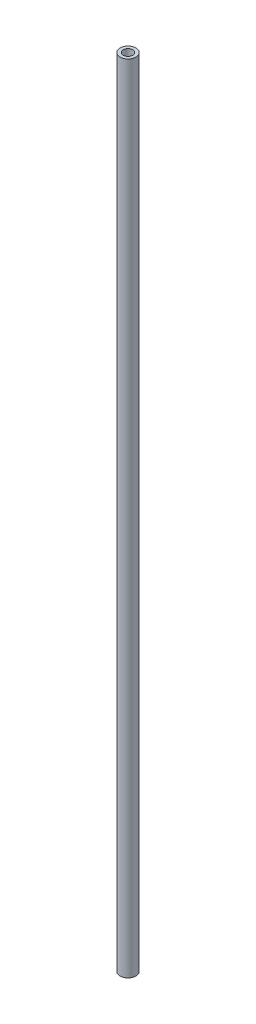
ISO-10303-21;
HEADER;
FILE_DESCRIPTION(('STEP AP214'),'2;1');
FILE_NAME('part.step','',(''),(''),'','','');
FILE_SCHEMA(('AUTOMOTIVE_DESIGN { 1 0 10303 214 1 1 1 1 }'));
ENDSEC;
DATA;
#1=APPLICATION_CONTEXT('core data for automotive mechanical design processes');
#2=APPLICATION_PROTOCOL_DEFINITION('international standard','automotive_design',2000,#1);
#3=PRODUCT_CONTEXT('',#1,'mechanical');
#4=PRODUCT('Part','Part','',(#3));
#5=PRODUCT_RELATED_PRODUCT_CATEGORY('part','',(#4));
#6=PRODUCT_DEFINITION_FORMATION('','',#4);
#7=PRODUCT_DEFINITION_CONTEXT('part definition',#1,'design');
#8=PRODUCT_DEFINITION('design','',#6,#7);
#9=PRODUCT_DEFINITION_SHAPE('','',#8);
#10=(LENGTH_UNIT() NAMED_UNIT(*) SI_UNIT(.MILLI.,.METRE.));
#11=(NAMED_UNIT(*) PLANE_ANGLE_UNIT() SI_UNIT($,.RADIAN.));
#12=(NAMED_UNIT(*) SI_UNIT($,.STERADIAN.) SOLID_ANGLE_UNIT());
#13=UNCERTAINTY_MEASURE_WITH_UNIT(LENGTH_MEASURE(1.E-05),#10,'distance_accuracy_value','');
#14=(GEOMETRIC_REPRESENTATION_CONTEXT(3) GLOBAL_UNCERTAINTY_ASSIGNED_CONTEXT((#13)) GLOBAL_UNIT_ASSIGNED_CONTEXT((#10,
#11,#12)) REPRESENTATION_CONTEXT('',''));
#15=CARTESIAN_POINT('',(0.,0.,0.));
#16=DIRECTION('',(0.,0.,1.));
#17=DIRECTION('',(1.,0.,0.));
#18=AXIS2_PLACEMENT_3D('',#15,#16,#17);
#19=CARTESIAN_POINT('',(0.,250.,0.));
#20=DIRECTION('',(0.,1.,0.));
#21=DIRECTION('',(0.,0.,1.));
#22=AXIS2_PLACEMENT_3D('',#19,#20,#21);
#23=PLANE('',#22);
#24=CARTESIAN_POINT('',(0.,250.,0.));
#25=DIRECTION('',(0.,1.,0.));
#26=DIRECTION('',(0.,0.,1.));
#27=AXIS2_PLACEMENT_3D('',#24,#25,#26);
#28=CIRCLE('',#27,2.5);
#29=CARTESIAN_POINT('',(0.,250.,2.5));
#30=VERTEX_POINT('',#29);
#31=EDGE_CURVE('E10',#30,#30,#28,.T.);
#32=ORIENTED_EDGE('',*,*,#31,.T.);
#33=EDGE_LOOP('',(#32));
#34=FACE_BOUND('',#33,.T.);
#35=CARTESIAN_POINT('',(0.,250.,0.));
#36=DIRECTION('',(0.,1.,0.));
#37=DIRECTION('',(0.,0.,1.));
#38=AXIS2_PLACEMENT_3D('',#35,#36,#37);
#39=CIRCLE('',#38,1.5);
#40=CARTESIAN_POINT('',(0.,250.,1.5));
#41=VERTEX_POINT('',#40);
#42=EDGE_CURVE('E44',#41,#41,#39,.T.);
#43=ORIENTED_EDGE('',*,*,#42,.F.);
#44=EDGE_LOOP('',(#43));
#45=FACE_BOUND('',#44,.T.);
#46=ADVANCED_FACE('F33',(#34,#45),#23,.T.);
#47=CARTESIAN_POINT('',(0.,0.,0.));
#48=DIRECTION('',(0.,1.,0.));
#49=DIRECTION('',(0.,0.,1.));
#50=AXIS2_PLACEMENT_3D('',#47,#48,#49);
#51=PLANE('',#50);
#52=CARTESIAN_POINT('',(0.,0.,0.));
#53=DIRECTION('',(0.,1.,0.));
#54=DIRECTION('',(0.,0.,1.));
#55=AXIS2_PLACEMENT_3D('',#52,#53,#54);
#56=CIRCLE('',#55,2.5);
#57=CARTESIAN_POINT('',(0.,0.,2.5));
#58=VERTEX_POINT('',#57);
#59=EDGE_CURVE('E37',#58,#58,#56,.T.);
#60=ORIENTED_EDGE('',*,*,#59,.F.);
#61=EDGE_LOOP('',(#60));
#62=FACE_BOUND('',#61,.T.);
#63=CARTESIAN_POINT('',(0.,0.,0.));
#64=DIRECTION('',(0.,1.,0.));
#65=DIRECTION('',(0.,0.,1.));
#66=AXIS2_PLACEMENT_3D('',#63,#64,#65);
#67=CIRCLE('',#66,1.5);
#68=CARTESIAN_POINT('',(0.,0.,1.5));
#69=VERTEX_POINT('',#68);
#70=EDGE_CURVE('E46',#69,#69,#67,.T.);
#71=ORIENTED_EDGE('',*,*,#70,.T.);
#72=EDGE_LOOP('',(#71));
#73=FACE_BOUND('',#72,.T.);
#74=ADVANCED_FACE('F56',(#62,#73),#51,.F.);
#75=CARTESIAN_POINT('',(0.,250.,0.));
#76=DIRECTION('',(0.,-1.,0.));
#77=DIRECTION('',(0.,0.,-1.));
#78=AXIS2_PLACEMENT_3D('',#75,#76,#77);
#79=CYLINDRICAL_SURFACE('',#78,2.5);
#80=ORIENTED_EDGE('',*,*,#31,.F.);
#81=EDGE_LOOP('',(#80));
#82=FACE_BOUND('',#81,.T.);
#83=ORIENTED_EDGE('',*,*,#59,.T.);
#84=EDGE_LOOP('',(#83));
#85=FACE_BOUND('',#84,.T.);
#86=ADVANCED_FACE('F35',(#82,#85),#79,.T.);
#87=CARTESIAN_POINT('',(0.,250.,0.));
#88=DIRECTION('',(0.,-1.,0.));
#89=DIRECTION('',(0.,0.,-1.));
#90=AXIS2_PLACEMENT_3D('',#87,#88,#89);
#91=CYLINDRICAL_SURFACE('',#90,1.5);
#92=ORIENTED_EDGE('',*,*,#42,.T.);
#93=EDGE_LOOP('',(#92));
#94=FACE_BOUND('',#93,.T.);
#95=ORIENTED_EDGE('',*,*,#70,.F.);
#96=EDGE_LOOP('',(#95));
#97=FACE_BOUND('',#96,.T.);
#98=ADVANCED_FACE('F52',(#94,#97),#91,.F.);
#99=CLOSED_SHELL('',(#46,#74,#86,#98));
#100=MANIFOLD_SOLID_BREP('B2',#99);
#101=ADVANCED_BREP_SHAPE_REPRESENTATION('',(#18,#100),#14);
#102=SHAPE_DEFINITION_REPRESENTATION(#9,#101);
ENDSEC;
END-ISO-10303-21;
